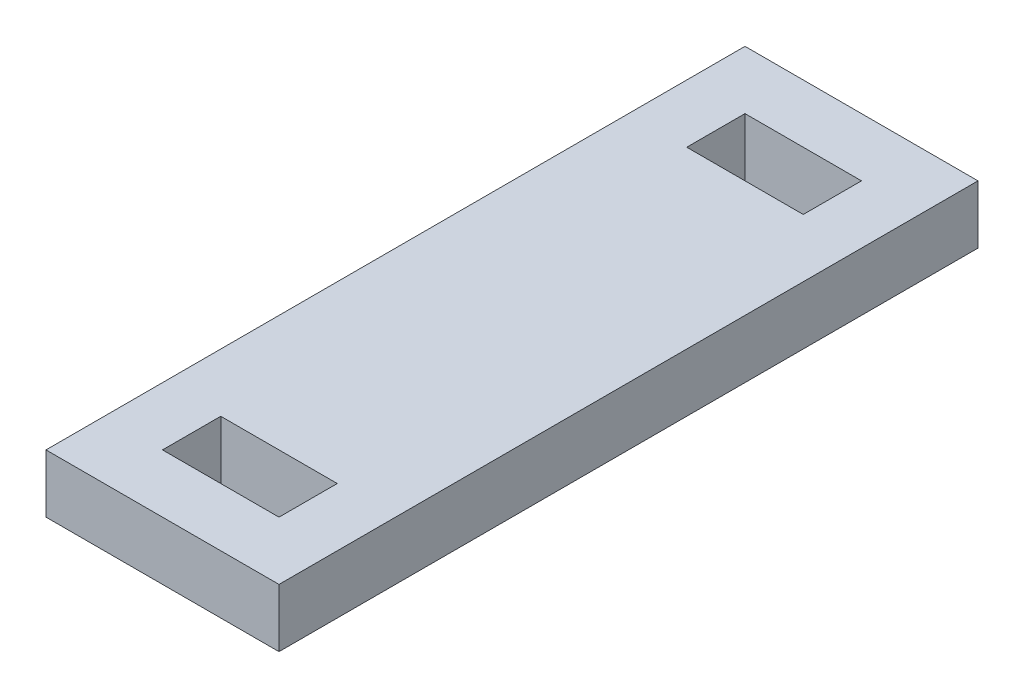
ISO-10303-21;
HEADER;
FILE_DESCRIPTION(('STEP AP214'),'2;1');
FILE_NAME('part.step','',(''),(''),'','','');
FILE_SCHEMA(('AUTOMOTIVE_DESIGN { 1 0 10303 214 1 1 1 1 }'));
ENDSEC;
DATA;
#1=APPLICATION_CONTEXT('core data for automotive mechanical design processes');
#2=APPLICATION_PROTOCOL_DEFINITION('international standard','automotive_design',2000,#1);
#3=PRODUCT_CONTEXT('',#1,'mechanical');
#4=PRODUCT('Part','Part','',(#3));
#5=PRODUCT_RELATED_PRODUCT_CATEGORY('part','',(#4));
#6=PRODUCT_DEFINITION_FORMATION('','',#4);
#7=PRODUCT_DEFINITION_CONTEXT('part definition',#1,'design');
#8=PRODUCT_DEFINITION('design','',#6,#7);
#9=PRODUCT_DEFINITION_SHAPE('','',#8);
#10=(LENGTH_UNIT() NAMED_UNIT(*) SI_UNIT(.MILLI.,.METRE.));
#11=(NAMED_UNIT(*) PLANE_ANGLE_UNIT() SI_UNIT($,.RADIAN.));
#12=(NAMED_UNIT(*) SI_UNIT($,.STERADIAN.) SOLID_ANGLE_UNIT());
#13=UNCERTAINTY_MEASURE_WITH_UNIT(LENGTH_MEASURE(1.E-05),#10,'distance_accuracy_value','');
#14=(GEOMETRIC_REPRESENTATION_CONTEXT(3) GLOBAL_UNCERTAINTY_ASSIGNED_CONTEXT((#13)) GLOBAL_UNIT_ASSIGNED_CONTEXT((#10,
#11,#12)) REPRESENTATION_CONTEXT('',''));
#15=CARTESIAN_POINT('',(0.,0.,0.));
#16=DIRECTION('',(0.,0.,1.));
#17=DIRECTION('',(1.,0.,0.));
#18=AXIS2_PLACEMENT_3D('',#15,#16,#17);
#19=CARTESIAN_POINT('',(0.,5.,0.));
#20=DIRECTION('',(0.,-1.,0.));
#21=DIRECTION('',(0.,0.,-1.));
#22=AXIS2_PLACEMENT_3D('',#19,#20,#21);
#23=PLANE('',#22);
#24=DIRECTION('',(0.,0.,1.));
#25=VECTOR('',#24,1.);
#26=CARTESIAN_POINT('',(-8.48148148148147,5.,-24.4337037037037));
#27=LINE('',#26,#25);
#28=CARTESIAN_POINT('',(-8.48148148148147,5.,-29.4337037037037));
#29=VERTEX_POINT('',#28);
#30=CARTESIAN_POINT('',(-8.48148148148147,5.,-24.4337037037037));
#31=VERTEX_POINT('',#30);
#32=EDGE_CURVE('E161',#29,#31,#27,.T.);
#33=ORIENTED_EDGE('',*,*,#32,.F.);
#34=DIRECTION('',(-1.,0.,0.));
#35=VECTOR('',#34,1.);
#36=CARTESIAN_POINT('',(-8.48148148148147,5.,-29.4337037037037));
#37=LINE('',#36,#35);
#38=CARTESIAN_POINT('',(1.51851851851853,5.,-29.4337037037037));
#39=VERTEX_POINT('',#38);
#40=EDGE_CURVE('E169',#39,#29,#37,.T.);
#41=ORIENTED_EDGE('',*,*,#40,.F.);
#42=DIRECTION('',(0.,0.,-1.));
#43=VECTOR('',#42,1.);
#44=CARTESIAN_POINT('',(1.51851851851853,5.,-24.4337037037037));
#45=LINE('',#44,#43);
#46=CARTESIAN_POINT('',(1.51851851851853,5.,-24.4337037037037));
#47=VERTEX_POINT('',#46);
#48=EDGE_CURVE('E166',#47,#39,#45,.T.);
#49=ORIENTED_EDGE('',*,*,#48,.F.);
#50=DIRECTION('',(1.,0.,0.));
#51=VECTOR('',#50,1.);
#52=CARTESIAN_POINT('',(-8.48148148148147,5.,-24.4337037037037));
#53=LINE('',#52,#51);
#54=EDGE_CURVE('E163',#31,#47,#53,.T.);
#55=ORIENTED_EDGE('',*,*,#54,.F.);
#56=EDGE_LOOP('',(#33,#41,#49,#55));
#57=FACE_BOUND('',#56,.T.);
#58=DIRECTION('',(0.,0.,1.));
#59=VECTOR('',#58,1.);
#60=CARTESIAN_POINT('',(-13.4814814814815,5.,-19.4337037037037));
#61=LINE('',#60,#59);
#62=CARTESIAN_POINT('',(-13.4814814814815,5.,-79.4337037037037));
#63=VERTEX_POINT('',#62);
#64=CARTESIAN_POINT('',(-13.4814814814815,5.,-19.4337037037037));
#65=VERTEX_POINT('',#64);
#66=EDGE_CURVE('E192',#63,#65,#61,.T.);
#67=ORIENTED_EDGE('',*,*,#66,.T.);
#68=DIRECTION('',(1.,0.,0.));
#69=VECTOR('',#68,1.);
#70=CARTESIAN_POINT('',(-13.4814814814815,5.,-19.4337037037037));
#71=LINE('',#70,#69);
#72=CARTESIAN_POINT('',(6.51851851851853,5.,-19.4337037037037));
#73=VERTEX_POINT('',#72);
#74=EDGE_CURVE('E195',#65,#73,#71,.T.);
#75=ORIENTED_EDGE('',*,*,#74,.T.);
#76=DIRECTION('',(0.,0.,-1.));
#77=VECTOR('',#76,1.);
#78=CARTESIAN_POINT('',(6.51851851851853,5.,-19.4337037037037));
#79=LINE('',#78,#77);
#80=CARTESIAN_POINT('',(6.51851851851853,5.,-79.4337037037037));
#81=VERTEX_POINT('',#80);
#82=EDGE_CURVE('E198',#73,#81,#79,.T.);
#83=ORIENTED_EDGE('',*,*,#82,.T.);
#84=DIRECTION('',(-1.,0.,0.));
#85=VECTOR('',#84,1.);
#86=CARTESIAN_POINT('',(-13.4814814814815,5.,-79.4337037037037));
#87=LINE('',#86,#85);
#88=EDGE_CURVE('E200',#81,#63,#87,.T.);
#89=ORIENTED_EDGE('',*,*,#88,.T.);
#90=EDGE_LOOP('',(#67,#75,#83,#89));
#91=FACE_BOUND('',#90,.T.);
#92=DIRECTION('',(0.,0.,1.));
#93=VECTOR('',#92,1.);
#94=CARTESIAN_POINT('',(-8.48148148148147,5.,-69.4337037037037));
#95=LINE('',#94,#93);
#96=CARTESIAN_POINT('',(-8.48148148148147,5.,-74.4337037037037));
#97=VERTEX_POINT('',#96);
#98=CARTESIAN_POINT('',(-8.48148148148147,5.,-69.4337037037037));
#99=VERTEX_POINT('',#98);
#100=EDGE_CURVE('E125',#97,#99,#95,.T.);
#101=ORIENTED_EDGE('',*,*,#100,.F.);
#102=DIRECTION('',(-1.,0.,0.));
#103=VECTOR('',#102,1.);
#104=CARTESIAN_POINT('',(-8.48148148148147,5.,-74.4337037037037));
#105=LINE('',#104,#103);
#106=CARTESIAN_POINT('',(1.51851851851853,5.,-74.4337037037037));
#107=VERTEX_POINT('',#106);
#108=EDGE_CURVE('E147',#107,#97,#105,.T.);
#109=ORIENTED_EDGE('',*,*,#108,.F.);
#110=DIRECTION('',(0.,0.,-1.));
#111=VECTOR('',#110,1.);
#112=CARTESIAN_POINT('',(1.51851851851853,5.,-69.4337037037037));
#113=LINE('',#112,#111);
#114=CARTESIAN_POINT('',(1.51851851851853,5.,-69.4337037037037));
#115=VERTEX_POINT('',#114);
#116=EDGE_CURVE('E145',#115,#107,#113,.T.);
#117=ORIENTED_EDGE('',*,*,#116,.F.);
#118=DIRECTION('',(1.,0.,0.));
#119=VECTOR('',#118,1.);
#120=CARTESIAN_POINT('',(-8.48148148148147,5.,-69.4337037037037));
#121=LINE('',#120,#119);
#122=EDGE_CURVE('E133',#99,#115,#121,.T.);
#123=ORIENTED_EDGE('',*,*,#122,.F.);
#124=EDGE_LOOP('',(#101,#109,#117,#123));
#125=FACE_BOUND('',#124,.T.);
#126=ADVANCED_FACE('F36',(#57,#91,#125),#23,.F.);
#127=CARTESIAN_POINT('',(0.,0.,0.));
#128=DIRECTION('',(0.,-1.,0.));
#129=DIRECTION('',(0.,0.,-1.));
#130=AXIS2_PLACEMENT_3D('',#127,#128,#129);
#131=PLANE('',#130);
#132=DIRECTION('',(0.,0.,1.));
#133=VECTOR('',#132,1.);
#134=CARTESIAN_POINT('',(-13.4814814814815,0.,-19.4337037037037));
#135=LINE('',#134,#133);
#136=CARTESIAN_POINT('',(-13.4814814814815,0.,-79.4337037037037));
#137=VERTEX_POINT('',#136);
#138=CARTESIAN_POINT('',(-13.4814814814815,0.,-19.4337037037037));
#139=VERTEX_POINT('',#138);
#140=EDGE_CURVE('E191',#137,#139,#135,.T.);
#141=ORIENTED_EDGE('',*,*,#140,.F.);
#142=DIRECTION('',(-1.,0.,0.));
#143=VECTOR('',#142,1.);
#144=CARTESIAN_POINT('',(-13.4814814814815,0.,-79.4337037037037));
#145=LINE('',#144,#143);
#146=CARTESIAN_POINT('',(6.51851851851853,0.,-79.4337037037037));
#147=VERTEX_POINT('',#146);
#148=EDGE_CURVE('E196',#147,#137,#145,.T.);
#149=ORIENTED_EDGE('',*,*,#148,.F.);
#150=DIRECTION('',(0.,0.,-1.));
#151=VECTOR('',#150,1.);
#152=CARTESIAN_POINT('',(6.51851851851853,0.,-19.4337037037037));
#153=LINE('',#152,#151);
#154=CARTESIAN_POINT('',(6.51851851851853,0.,-19.4337037037037));
#155=VERTEX_POINT('',#154);
#156=EDGE_CURVE('E207',#155,#147,#153,.T.);
#157=ORIENTED_EDGE('',*,*,#156,.F.);
#158=DIRECTION('',(1.,0.,0.));
#159=VECTOR('',#158,1.);
#160=CARTESIAN_POINT('',(-13.4814814814815,0.,-19.4337037037037));
#161=LINE('',#160,#159);
#162=EDGE_CURVE('E205',#139,#155,#161,.T.);
#163=ORIENTED_EDGE('',*,*,#162,.F.);
#164=EDGE_LOOP('',(#141,#149,#157,#163));
#165=FACE_BOUND('',#164,.T.);
#166=DIRECTION('',(-1.,0.,0.));
#167=VECTOR('',#166,1.);
#168=CARTESIAN_POINT('',(-8.48148148148147,0.,-29.4337037037037));
#169=LINE('',#168,#167);
#170=CARTESIAN_POINT('',(1.51851851851853,0.,-29.4337037037037));
#171=VERTEX_POINT('',#170);
#172=CARTESIAN_POINT('',(-8.48148148148147,0.,-29.4337037037037));
#173=VERTEX_POINT('',#172);
#174=EDGE_CURVE('E164',#171,#173,#169,.T.);
#175=ORIENTED_EDGE('',*,*,#174,.T.);
#176=DIRECTION('',(0.,0.,1.));
#177=VECTOR('',#176,1.);
#178=CARTESIAN_POINT('',(-8.48148148148147,0.,-24.4337037037037));
#179=LINE('',#178,#177);
#180=CARTESIAN_POINT('',(-8.48148148148147,0.,-24.4337037037037));
#181=VERTEX_POINT('',#180);
#182=EDGE_CURVE('E141',#173,#181,#179,.T.);
#183=ORIENTED_EDGE('',*,*,#182,.T.);
#184=DIRECTION('',(1.,0.,0.));
#185=VECTOR('',#184,1.);
#186=CARTESIAN_POINT('',(-8.48148148148147,0.,-24.4337037037037));
#187=LINE('',#186,#185);
#188=CARTESIAN_POINT('',(1.51851851851853,0.,-24.4337037037037));
#189=VERTEX_POINT('',#188);
#190=EDGE_CURVE('E174',#181,#189,#187,.T.);
#191=ORIENTED_EDGE('',*,*,#190,.T.);
#192=DIRECTION('',(0.,0.,-1.));
#193=VECTOR('',#192,1.);
#194=CARTESIAN_POINT('',(1.51851851851853,0.,-24.4337037037037));
#195=LINE('',#194,#193);
#196=EDGE_CURVE('E177',#189,#171,#195,.T.);
#197=ORIENTED_EDGE('',*,*,#196,.T.);
#198=EDGE_LOOP('',(#175,#183,#191,#197));
#199=FACE_BOUND('',#198,.T.);
#200=DIRECTION('',(-1.,0.,0.));
#201=VECTOR('',#200,1.);
#202=CARTESIAN_POINT('',(-8.48148148148147,0.,-74.4337037037037));
#203=LINE('',#202,#201);
#204=CARTESIAN_POINT('',(1.51851851851853,0.,-74.4337037037037));
#205=VERTEX_POINT('',#204);
#206=CARTESIAN_POINT('',(-8.48148148148147,0.,-74.4337037037037));
#207=VERTEX_POINT('',#206);
#208=EDGE_CURVE('E134',#205,#207,#203,.T.);
#209=ORIENTED_EDGE('',*,*,#208,.T.);
#210=DIRECTION('',(0.,0.,1.));
#211=VECTOR('',#210,1.);
#212=CARTESIAN_POINT('',(-8.48148148148147,0.,-69.4337037037037));
#213=LINE('',#212,#211);
#214=CARTESIAN_POINT('',(-8.48148148148147,0.,-69.4337037037037));
#215=VERTEX_POINT('',#214);
#216=EDGE_CURVE('E59',#207,#215,#213,.T.);
#217=ORIENTED_EDGE('',*,*,#216,.T.);
#218=DIRECTION('',(1.,0.,0.));
#219=VECTOR('',#218,1.);
#220=CARTESIAN_POINT('',(-8.48148148148147,0.,-69.4337037037037));
#221=LINE('',#220,#219);
#222=CARTESIAN_POINT('',(1.51851851851853,0.,-69.4337037037037));
#223=VERTEX_POINT('',#222);
#224=EDGE_CURVE('E140',#215,#223,#221,.T.);
#225=ORIENTED_EDGE('',*,*,#224,.T.);
#226=DIRECTION('',(0.,0.,-1.));
#227=VECTOR('',#226,1.);
#228=CARTESIAN_POINT('',(1.51851851851853,0.,-69.4337037037037));
#229=LINE('',#228,#227);
#230=EDGE_CURVE('E153',#223,#205,#229,.T.);
#231=ORIENTED_EDGE('',*,*,#230,.T.);
#232=EDGE_LOOP('',(#209,#217,#225,#231));
#233=FACE_BOUND('',#232,.T.);
#234=ADVANCED_FACE('F225',(#165,#199,#233),#131,.T.);
#235=CARTESIAN_POINT('',(-13.4814814814815,5.,-19.4337037037037));
#236=DIRECTION('',(1.,0.,0.));
#237=DIRECTION('',(0.,0.,-1.));
#238=AXIS2_PLACEMENT_3D('',#235,#236,#237);
#239=PLANE('',#238);
#240=ORIENTED_EDGE('',*,*,#140,.T.);
#241=DIRECTION('',(0.,-1.,0.));
#242=VECTOR('',#241,1.);
#243=CARTESIAN_POINT('',(-13.4814814814815,5.,-19.4337037037037));
#244=LINE('',#243,#242);
#245=EDGE_CURVE('E11',#65,#139,#244,.T.);
#246=ORIENTED_EDGE('',*,*,#245,.F.);
#247=ORIENTED_EDGE('',*,*,#66,.F.);
#248=DIRECTION('',(0.,-1.,0.));
#249=VECTOR('',#248,1.);
#250=CARTESIAN_POINT('',(-13.4814814814815,5.,-79.4337037037037));
#251=LINE('',#250,#249);
#252=EDGE_CURVE('E202',#63,#137,#251,.T.);
#253=ORIENTED_EDGE('',*,*,#252,.T.);
#254=EDGE_LOOP('',(#240,#246,#247,#253));
#255=FACE_BOUND('',#254,.T.);
#256=ADVANCED_FACE('F38',(#255),#239,.F.);
#257=CARTESIAN_POINT('',(-13.4814814814815,5.,-19.4337037037037));
#258=DIRECTION('',(0.,0.,-1.));
#259=DIRECTION('',(-1.,0.,0.));
#260=AXIS2_PLACEMENT_3D('',#257,#258,#259);
#261=PLANE('',#260);
#262=ORIENTED_EDGE('',*,*,#162,.T.);
#263=DIRECTION('',(0.,-1.,0.));
#264=VECTOR('',#263,1.);
#265=CARTESIAN_POINT('',(6.51851851851853,5.,-19.4337037037037));
#266=LINE('',#265,#264);
#267=EDGE_CURVE('E44',#73,#155,#266,.T.);
#268=ORIENTED_EDGE('',*,*,#267,.F.);
#269=ORIENTED_EDGE('',*,*,#74,.F.);
#270=ORIENTED_EDGE('',*,*,#245,.T.);
#271=EDGE_LOOP('',(#262,#268,#269,#270));
#272=FACE_BOUND('',#271,.T.);
#273=ADVANCED_FACE('F235',(#272),#261,.F.);
#274=CARTESIAN_POINT('',(6.51851851851853,5.,-19.4337037037037));
#275=DIRECTION('',(-1.,0.,0.));
#276=DIRECTION('',(0.,0.,1.));
#277=AXIS2_PLACEMENT_3D('',#274,#275,#276);
#278=PLANE('',#277);
#279=ORIENTED_EDGE('',*,*,#156,.T.);
#280=DIRECTION('',(0.,-1.,0.));
#281=VECTOR('',#280,1.);
#282=CARTESIAN_POINT('',(6.51851851851853,5.,-79.4337037037037));
#283=LINE('',#282,#281);
#284=EDGE_CURVE('E212',#81,#147,#283,.T.);
#285=ORIENTED_EDGE('',*,*,#284,.F.);
#286=ORIENTED_EDGE('',*,*,#82,.F.);
#287=ORIENTED_EDGE('',*,*,#267,.T.);
#288=EDGE_LOOP('',(#279,#285,#286,#287));
#289=FACE_BOUND('',#288,.T.);
#290=ADVANCED_FACE('F219',(#289),#278,.F.);
#291=CARTESIAN_POINT('',(-13.4814814814815,5.,-79.4337037037037));
#292=DIRECTION('',(0.,0.,1.));
#293=DIRECTION('',(1.,0.,0.));
#294=AXIS2_PLACEMENT_3D('',#291,#292,#293);
#295=PLANE('',#294);
#296=ORIENTED_EDGE('',*,*,#148,.T.);
#297=ORIENTED_EDGE('',*,*,#252,.F.);
#298=ORIENTED_EDGE('',*,*,#88,.F.);
#299=ORIENTED_EDGE('',*,*,#284,.T.);
#300=EDGE_LOOP('',(#296,#297,#298,#299));
#301=FACE_BOUND('',#300,.T.);
#302=ADVANCED_FACE('F229',(#301),#295,.F.);
#303=CARTESIAN_POINT('',(-8.48148148148147,5.,-24.4337037037037));
#304=DIRECTION('',(1.,0.,0.));
#305=DIRECTION('',(0.,0.,-1.));
#306=AXIS2_PLACEMENT_3D('',#303,#304,#305);
#307=PLANE('',#306);
#308=ORIENTED_EDGE('',*,*,#182,.F.);
#309=DIRECTION('',(0.,-1.,0.));
#310=VECTOR('',#309,1.);
#311=CARTESIAN_POINT('',(-8.48148148148147,5.,-29.4337037037037));
#312=LINE('',#311,#310);
#313=EDGE_CURVE('E171',#29,#173,#312,.T.);
#314=ORIENTED_EDGE('',*,*,#313,.F.);
#315=ORIENTED_EDGE('',*,*,#32,.T.);
#316=DIRECTION('',(0.,-1.,0.));
#317=VECTOR('',#316,1.);
#318=CARTESIAN_POINT('',(-8.48148148148147,5.,-24.4337037037037));
#319=LINE('',#318,#317);
#320=EDGE_CURVE('E188',#31,#181,#319,.T.);
#321=ORIENTED_EDGE('',*,*,#320,.T.);
#322=EDGE_LOOP('',(#308,#314,#315,#321));
#323=FACE_BOUND('',#322,.T.);
#324=ADVANCED_FACE('F251',(#323),#307,.T.);
#325=CARTESIAN_POINT('',(-8.48148148148147,5.,-24.4337037037037));
#326=DIRECTION('',(0.,0.,-1.));
#327=DIRECTION('',(-1.,0.,0.));
#328=AXIS2_PLACEMENT_3D('',#325,#326,#327);
#329=PLANE('',#328);
#330=ORIENTED_EDGE('',*,*,#190,.F.);
#331=ORIENTED_EDGE('',*,*,#320,.F.);
#332=ORIENTED_EDGE('',*,*,#54,.T.);
#333=DIRECTION('',(0.,-1.,0.));
#334=VECTOR('',#333,1.);
#335=CARTESIAN_POINT('',(1.51851851851853,5.,-24.4337037037037));
#336=LINE('',#335,#334);
#337=EDGE_CURVE('E186',#47,#189,#336,.T.);
#338=ORIENTED_EDGE('',*,*,#337,.T.);
#339=EDGE_LOOP('',(#330,#331,#332,#338));
#340=FACE_BOUND('',#339,.T.);
#341=ADVANCED_FACE('F258',(#340),#329,.T.);
#342=CARTESIAN_POINT('',(1.51851851851853,5.,-24.4337037037037));
#343=DIRECTION('',(-1.,0.,0.));
#344=DIRECTION('',(0.,0.,1.));
#345=AXIS2_PLACEMENT_3D('',#342,#343,#344);
#346=PLANE('',#345);
#347=ORIENTED_EDGE('',*,*,#196,.F.);
#348=ORIENTED_EDGE('',*,*,#337,.F.);
#349=ORIENTED_EDGE('',*,*,#48,.T.);
#350=DIRECTION('',(0.,-1.,0.));
#351=VECTOR('',#350,1.);
#352=CARTESIAN_POINT('',(1.51851851851853,5.,-29.4337037037037));
#353=LINE('',#352,#351);
#354=EDGE_CURVE('E184',#39,#171,#353,.T.);
#355=ORIENTED_EDGE('',*,*,#354,.T.);
#356=EDGE_LOOP('',(#347,#348,#349,#355));
#357=FACE_BOUND('',#356,.T.);
#358=ADVANCED_FACE('F263',(#357),#346,.T.);
#359=CARTESIAN_POINT('',(-8.48148148148147,5.,-29.4337037037037));
#360=DIRECTION('',(0.,0.,1.));
#361=DIRECTION('',(1.,0.,0.));
#362=AXIS2_PLACEMENT_3D('',#359,#360,#361);
#363=PLANE('',#362);
#364=ORIENTED_EDGE('',*,*,#174,.F.);
#365=ORIENTED_EDGE('',*,*,#354,.F.);
#366=ORIENTED_EDGE('',*,*,#40,.T.);
#367=ORIENTED_EDGE('',*,*,#313,.T.);
#368=EDGE_LOOP('',(#364,#365,#366,#367));
#369=FACE_BOUND('',#368,.T.);
#370=ADVANCED_FACE('F269',(#369),#363,.T.);
#371=CARTESIAN_POINT('',(-8.48148148148147,5.,-69.4337037037037));
#372=DIRECTION('',(1.,0.,0.));
#373=DIRECTION('',(0.,0.,-1.));
#374=AXIS2_PLACEMENT_3D('',#371,#372,#373);
#375=PLANE('',#374);
#376=ORIENTED_EDGE('',*,*,#216,.F.);
#377=DIRECTION('',(0.,-1.,0.));
#378=VECTOR('',#377,1.);
#379=CARTESIAN_POINT('',(-8.48148148148147,5.,-74.4337037037037));
#380=LINE('',#379,#378);
#381=EDGE_CURVE('E129',#97,#207,#380,.T.);
#382=ORIENTED_EDGE('',*,*,#381,.F.);
#383=ORIENTED_EDGE('',*,*,#100,.T.);
#384=DIRECTION('',(0.,-1.,0.));
#385=VECTOR('',#384,1.);
#386=CARTESIAN_POINT('',(-8.48148148148147,5.,-69.4337037037037));
#387=LINE('',#386,#385);
#388=EDGE_CURVE('E128',#99,#215,#387,.T.);
#389=ORIENTED_EDGE('',*,*,#388,.T.);
#390=EDGE_LOOP('',(#376,#382,#383,#389));
#391=FACE_BOUND('',#390,.T.);
#392=ADVANCED_FACE('F127',(#391),#375,.T.);
#393=CARTESIAN_POINT('',(-8.48148148148147,5.,-69.4337037037037));
#394=DIRECTION('',(0.,0.,-1.));
#395=DIRECTION('',(-1.,0.,0.));
#396=AXIS2_PLACEMENT_3D('',#393,#394,#395);
#397=PLANE('',#396);
#398=ORIENTED_EDGE('',*,*,#224,.F.);
#399=ORIENTED_EDGE('',*,*,#388,.F.);
#400=ORIENTED_EDGE('',*,*,#122,.T.);
#401=DIRECTION('',(0.,-1.,0.));
#402=VECTOR('',#401,1.);
#403=CARTESIAN_POINT('',(1.51851851851853,5.,-69.4337037037037));
#404=LINE('',#403,#402);
#405=EDGE_CURVE('E142',#115,#223,#404,.T.);
#406=ORIENTED_EDGE('',*,*,#405,.T.);
#407=EDGE_LOOP('',(#398,#399,#400,#406));
#408=FACE_BOUND('',#407,.T.);
#409=ADVANCED_FACE('F137',(#408),#397,.T.);
#410=CARTESIAN_POINT('',(1.51851851851853,5.,-69.4337037037037));
#411=DIRECTION('',(-1.,0.,0.));
#412=DIRECTION('',(0.,0.,1.));
#413=AXIS2_PLACEMENT_3D('',#410,#411,#412);
#414=PLANE('',#413);
#415=ORIENTED_EDGE('',*,*,#230,.F.);
#416=ORIENTED_EDGE('',*,*,#405,.F.);
#417=ORIENTED_EDGE('',*,*,#116,.T.);
#418=DIRECTION('',(0.,-1.,0.));
#419=VECTOR('',#418,1.);
#420=CARTESIAN_POINT('',(1.51851851851853,5.,-74.4337037037037));
#421=LINE('',#420,#419);
#422=EDGE_CURVE('E51',#107,#205,#421,.T.);
#423=ORIENTED_EDGE('',*,*,#422,.T.);
#424=EDGE_LOOP('',(#415,#416,#417,#423));
#425=FACE_BOUND('',#424,.T.);
#426=ADVANCED_FACE('F288',(#425),#414,.T.);
#427=CARTESIAN_POINT('',(-8.48148148148147,5.,-74.4337037037037));
#428=DIRECTION('',(0.,0.,1.));
#429=DIRECTION('',(1.,0.,0.));
#430=AXIS2_PLACEMENT_3D('',#427,#428,#429);
#431=PLANE('',#430);
#432=ORIENTED_EDGE('',*,*,#208,.F.);
#433=ORIENTED_EDGE('',*,*,#422,.F.);
#434=ORIENTED_EDGE('',*,*,#108,.T.);
#435=ORIENTED_EDGE('',*,*,#381,.T.);
#436=EDGE_LOOP('',(#432,#433,#434,#435));
#437=FACE_BOUND('',#436,.T.);
#438=ADVANCED_FACE('F291',(#437),#431,.T.);
#439=CLOSED_SHELL('',(#126,#234,#256,#273,#290,#302,#324,#341,#358,#370,#392,#409,#426,#438));
#440=MANIFOLD_SOLID_BREP('B2',#439);
#441=ADVANCED_BREP_SHAPE_REPRESENTATION('',(#18,#440),#14);
#442=SHAPE_DEFINITION_REPRESENTATION(#9,#441);
ENDSEC;
END-ISO-10303-21;
